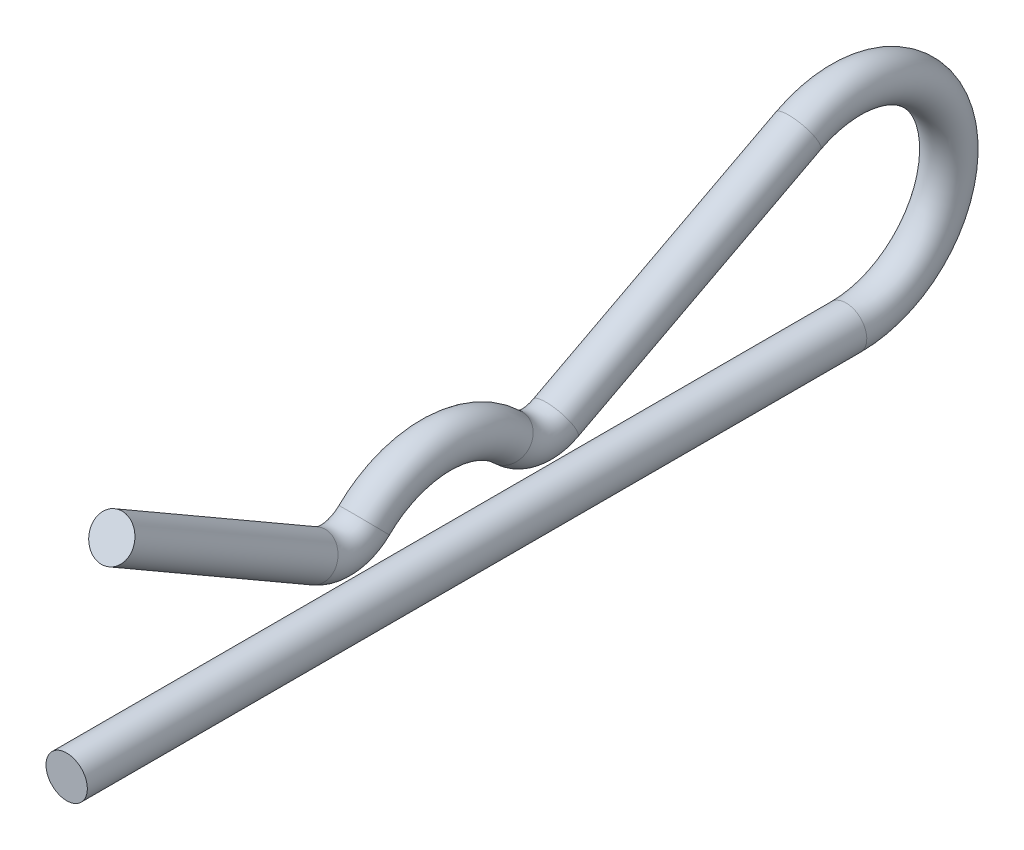
ISO-10303-21;
HEADER;
FILE_DESCRIPTION(('STEP AP214'),'2;1');
FILE_NAME('part.step','',(''),(''),'','','');
FILE_SCHEMA(('AUTOMOTIVE_DESIGN { 1 0 10303 214 1 1 1 1 }'));
ENDSEC;
DATA;
#1=APPLICATION_CONTEXT('core data for automotive mechanical design processes');
#2=APPLICATION_PROTOCOL_DEFINITION('international standard','automotive_design',2000,#1);
#3=PRODUCT_CONTEXT('',#1,'mechanical');
#4=PRODUCT('Part','Part','',(#3));
#5=PRODUCT_RELATED_PRODUCT_CATEGORY('part','',(#4));
#6=PRODUCT_DEFINITION_FORMATION('','',#4);
#7=PRODUCT_DEFINITION_CONTEXT('part definition',#1,'design');
#8=PRODUCT_DEFINITION('design','',#6,#7);
#9=PRODUCT_DEFINITION_SHAPE('','',#8);
#10=(LENGTH_UNIT() NAMED_UNIT(*) SI_UNIT(.MILLI.,.METRE.));
#11=(NAMED_UNIT(*) PLANE_ANGLE_UNIT() SI_UNIT($,.RADIAN.));
#12=(NAMED_UNIT(*) SI_UNIT($,.STERADIAN.) SOLID_ANGLE_UNIT());
#13=UNCERTAINTY_MEASURE_WITH_UNIT(LENGTH_MEASURE(1.E-05),#10,'distance_accuracy_value','');
#14=(GEOMETRIC_REPRESENTATION_CONTEXT(3) GLOBAL_UNCERTAINTY_ASSIGNED_CONTEXT((#13)) GLOBAL_UNIT_ASSIGNED_CONTEXT((#10,
#11,#12)) REPRESENTATION_CONTEXT('',''));
#15=CARTESIAN_POINT('',(0.,0.,0.));
#16=DIRECTION('',(0.,0.,1.));
#17=DIRECTION('',(1.,0.,0.));
#18=AXIS2_PLACEMENT_3D('',#15,#16,#17);
#19=CARTESIAN_POINT('',(0.,2.60028467149222,-9.60259352023716));
#20=DIRECTION('',(0.,0.499999999999991,0.866025403784444));
#21=DIRECTION('',(0.,-0.866025403784444,0.499999999999991));
#22=AXIS2_PLACEMENT_3D('',#19,#20,#21);
#23=CYLINDRICAL_SURFACE('',#22,0.8001);
#24=CARTESIAN_POINT('',(0.,2.60028467149222,-9.60259352023716));
#25=DIRECTION('',(0.,-0.499999999999977,-0.866025403784452));
#26=DIRECTION('',(1.,0.,0.));
#27=AXIS2_PLACEMENT_3D('',#24,#25,#26);
#28=CIRCLE('',#27,0.8001);
#29=CARTESIAN_POINT('',(0.,1.90737774592431,-9.20254352023714));
#30=VERTEX_POINT('',#29);
#31=EDGE_CURVE('E36',#30,#30,#28,.T.);
#32=ORIENTED_EDGE('',*,*,#31,.F.);
#33=EDGE_LOOP('',(#32));
#34=FACE_BOUND('',#33,.T.);
#35=CARTESIAN_POINT('',(0.,7.13614671774724,-1.74624999999995));
#36=DIRECTION('',(0.,-0.499999999999977,-0.866025403784452));
#37=DIRECTION('',(1.,0.,0.));
#38=AXIS2_PLACEMENT_3D('',#35,#36,#37);
#39=CIRCLE('',#38,0.8001);
#40=CARTESIAN_POINT('',(0.8001,7.13614671774724,-1.74624999999995));
#41=VERTEX_POINT('',#40);
#42=EDGE_CURVE('E10',#41,#41,#39,.T.);
#43=ORIENTED_EDGE('',*,*,#42,.T.);
#44=EDGE_LOOP('',(#43));
#45=FACE_BOUND('',#44,.T.);
#46=ADVANCED_FACE('F30',(#34,#45),#23,.T.);
#47=CARTESIAN_POINT('',(0.,3.9751,-10.3963435202372));
#48=DIRECTION('',(-1.,0.,0.));
#49=DIRECTION('',(0.,0.,1.));
#50=AXIS2_PLACEMENT_3D('',#47,#48,#49);
#51=TOROIDAL_SURFACE('',#50,1.5875,0.8001);
#52=CARTESIAN_POINT('',(0.,2.84065365296799,-11.5068333831832));
#53=DIRECTION('',(0.,0.699521173509305,-0.714611872146108));
#54=DIRECTION('',(1.,0.,0.));
#55=AXIS2_PLACEMENT_3D('',#52,#53,#54);
#56=CIRCLE('',#55,0.8001);
#57=CARTESIAN_POINT('',(0.,2.26889269406386,-12.0665202741079));
#58=VERTEX_POINT('',#57);
#59=EDGE_CURVE('E40',#58,#58,#56,.T.);
#60=CARTESIAN_POINT('',(0.,3.9751,-10.3963435202372));
#61=DIRECTION('',(-1.,0.,0.));
#62=DIRECTION('',(0.,0.,1.));
#63=AXIS2_PLACEMENT_3D('',#60,#61,#62);
#64=CIRCLE('',#63,2.3876);
#65=EDGE_CURVE('',#58,#30,#64,.T.);
#66=ORIENTED_EDGE('',*,*,#59,.F.);
#67=ORIENTED_EDGE('',*,*,#31,.T.);
#68=ORIENTED_EDGE('',*,*,#65,.T.);
#69=ORIENTED_EDGE('',*,*,#65,.F.);
#70=EDGE_LOOP('',(#66,#68,#67,#69));
#71=FACE_BOUND('',#70,.T.);
#72=ADVANCED_FACE('F86',(#71),#51,.T.);
#73=CARTESIAN_POINT('',(0.,0.,-14.2875));
#74=DIRECTION('',(1.,0.,0.));
#75=DIRECTION('',(0.,0.,-1.));
#76=AXIS2_PLACEMENT_3D('',#73,#74,#75);
#77=TOROIDAL_SURFACE('',#76,3.9751,0.8001);
#78=CARTESIAN_POINT('',(0.,2.84065365296808,-17.0681666168168));
#79=DIRECTION('',(0.,-0.699521173509284,-0.714611872146128));
#80=DIRECTION('',(1.,0.,0.));
#81=AXIS2_PLACEMENT_3D('',#78,#79,#80);
#82=CIRCLE('',#81,0.8001);
#83=CARTESIAN_POINT('',(0.,2.26889269406399,-16.5084797258919));
#84=VERTEX_POINT('',#83);
#85=EDGE_CURVE('E44',#84,#84,#82,.T.);
#86=ORIENTED_EDGE('',*,*,#85,.F.);
#87=EDGE_LOOP('',(#86));
#88=FACE_BOUND('',#87,.T.);
#89=ORIENTED_EDGE('',*,*,#59,.T.);
#90=EDGE_LOOP('',(#89));
#91=FACE_BOUND('',#90,.T.);
#92=ADVANCED_FACE('F80',(#88,#91),#77,.T.);
#93=CARTESIAN_POINT('',(0.,3.9751,-18.1786564797628));
#94=DIRECTION('',(-1.,0.,0.));
#95=DIRECTION('',(0.,0.,1.));
#96=AXIS2_PLACEMENT_3D('',#93,#94,#95);
#97=TOROIDAL_SURFACE('',#96,1.5875,0.8001);
#98=CARTESIAN_POINT('',(0.,2.56939208507711,-18.9163159594166));
#99=DIRECTION('',(0.,0.464667388758358,-0.885485300738803));
#100=DIRECTION('',(1.,0.,0.));
#101=AXIS2_PLACEMENT_3D('',#98,#99,#100);
#102=CIRCLE('',#101,0.8001);
#103=CARTESIAN_POINT('',(0.,1.86091529595597,-19.2880963371621));
#104=VERTEX_POINT('',#103);
#105=EDGE_CURVE('E49',#104,#104,#102,.T.);
#106=CARTESIAN_POINT('',(0.,3.9751,-18.1786564797628));
#107=DIRECTION('',(-1.,0.,0.));
#108=DIRECTION('',(0.,0.,1.));
#109=AXIS2_PLACEMENT_3D('',#106,#107,#108);
#110=CIRCLE('',#109,2.3876);
#111=EDGE_CURVE('',#104,#84,#110,.T.);
#112=ORIENTED_EDGE('',*,*,#105,.F.);
#113=ORIENTED_EDGE('',*,*,#85,.T.);
#114=ORIENTED_EDGE('',*,*,#111,.T.);
#115=ORIENTED_EDGE('',*,*,#111,.F.);
#116=EDGE_LOOP('',(#112,#114,#113,#115));
#117=FACE_BOUND('',#116,.T.);
#118=ADVANCED_FACE('F74',(#117),#97,.T.);
#119=CARTESIAN_POINT('',(0.,7.49499261896681,-28.3027006629466));
#120=DIRECTION('',(0.,-0.464667388758345,0.88548530073881));
#121=DIRECTION('',(0.,-0.88548530073881,-0.464667388758345));
#122=AXIS2_PLACEMENT_3D('',#119,#120,#121);
#123=CYLINDRICAL_SURFACE('',#122,0.8001);
#124=CARTESIAN_POINT('',(0.,7.49499261896681,-28.3027006629466));
#125=DIRECTION('',(0.,0.464667388758358,-0.885485300738803));
#126=DIRECTION('',(1.,0.,0.));
#127=AXIS2_PLACEMENT_3D('',#124,#125,#126);
#128=CIRCLE('',#127,0.8001);
#129=CARTESIAN_POINT('',(0.,8.20346940808792,-27.9309202852011));
#130=VERTEX_POINT('',#129);
#131=EDGE_CURVE('E52',#130,#130,#128,.T.);
#132=ORIENTED_EDGE('',*,*,#131,.F.);
#133=EDGE_LOOP('',(#132));
#134=FACE_BOUND('',#133,.T.);
#135=ORIENTED_EDGE('',*,*,#105,.T.);
#136=EDGE_LOOP('',(#135));
#137=FACE_BOUND('',#136,.T.);
#138=ADVANCED_FACE('F68',(#134,#137),#123,.T.);
#139=CARTESIAN_POINT('',(0.,3.97509999999999,-30.1498));
#140=DIRECTION('',(1.,0.,0.));
#141=DIRECTION('',(0.,0.,-1.));
#142=AXIS2_PLACEMENT_3D('',#139,#140,#141);
#143=TOROIDAL_SURFACE('',#142,3.97509999999999,0.8001);
#144=CARTESIAN_POINT('',(0.,0.,-30.1498));
#145=DIRECTION('',(0.,0.,1.));
#146=DIRECTION('',(1.,0.,0.));
#147=AXIS2_PLACEMENT_3D('',#144,#145,#146);
#148=CIRCLE('',#147,0.8001);
#149=CARTESIAN_POINT('',(0.,-0.8001,-30.1498));
#150=VERTEX_POINT('',#149);
#151=EDGE_CURVE('E55',#150,#150,#148,.T.);
#152=CARTESIAN_POINT('',(0.,3.97509999999999,-30.1498));
#153=DIRECTION('',(1.,0.,0.));
#154=DIRECTION('',(0.,0.,-1.));
#155=AXIS2_PLACEMENT_3D('',#152,#153,#154);
#156=CIRCLE('',#155,4.77519999999999);
#157=EDGE_CURVE('',#150,#130,#156,.T.);
#158=ORIENTED_EDGE('',*,*,#151,.F.);
#159=ORIENTED_EDGE('',*,*,#131,.T.);
#160=ORIENTED_EDGE('',*,*,#157,.T.);
#161=ORIENTED_EDGE('',*,*,#157,.F.);
#162=EDGE_LOOP('',(#158,#160,#159,#161));
#163=FACE_BOUND('',#162,.T.);
#164=ADVANCED_FACE('F65',(#163),#143,.T.);
#165=CARTESIAN_POINT('',(0.,0.,-30.1498));
#166=DIRECTION('',(0.,0.,1.));
#167=DIRECTION('',(0.,-1.,0.));
#168=AXIS2_PLACEMENT_3D('',#165,#166,#167);
#169=CYLINDRICAL_SURFACE('',#168,0.8001);
#170=ORIENTED_EDGE('',*,*,#151,.T.);
#171=EDGE_LOOP('',(#170));
#172=FACE_BOUND('',#171,.T.);
#173=CARTESIAN_POINT('',(0.,0.,0.));
#174=DIRECTION('',(0.,0.,1.));
#175=DIRECTION('',(1.,0.,0.));
#176=AXIS2_PLACEMENT_3D('',#173,#174,#175);
#177=CIRCLE('',#176,0.8001);
#178=CARTESIAN_POINT('',(0.8001,0.,0.));
#179=VERTEX_POINT('',#178);
#180=EDGE_CURVE('E56',#179,#179,#177,.T.);
#181=ORIENTED_EDGE('',*,*,#180,.F.);
#182=EDGE_LOOP('',(#181));
#183=FACE_BOUND('',#182,.T.);
#184=ADVANCED_FACE('F62',(#172,#183),#169,.T.);
#185=CARTESIAN_POINT('',(0.,7.13614671774724,-1.74624999999995));
#186=DIRECTION('',(0.,-0.499999999999977,-0.866025403784452));
#187=DIRECTION('',(1.,0.,0.));
#188=AXIS2_PLACEMENT_3D('',#185,#186,#187);
#189=PLANE('',#188);
#190=ORIENTED_EDGE('',*,*,#42,.F.);
#191=EDGE_LOOP('',(#190));
#192=FACE_BOUND('',#191,.T.);
#193=ADVANCED_FACE('F98',(#192),#189,.F.);
#194=CARTESIAN_POINT('',(0.,0.,0.));
#195=DIRECTION('',(0.,0.,1.));
#196=DIRECTION('',(1.,0.,0.));
#197=AXIS2_PLACEMENT_3D('',#194,#195,#196);
#198=PLANE('',#197);
#199=ORIENTED_EDGE('',*,*,#180,.T.);
#200=EDGE_LOOP('',(#199));
#201=FACE_BOUND('',#200,.T.);
#202=ADVANCED_FACE('F99',(#201),#198,.T.);
#203=CLOSED_SHELL('',(#46,#72,#92,#118,#138,#164,#184,#193,#202));
#204=MANIFOLD_SOLID_BREP('B2',#203);
#205=ADVANCED_BREP_SHAPE_REPRESENTATION('',(#18,#204),#14);
#206=SHAPE_DEFINITION_REPRESENTATION(#9,#205);
ENDSEC;
END-ISO-10303-21;
